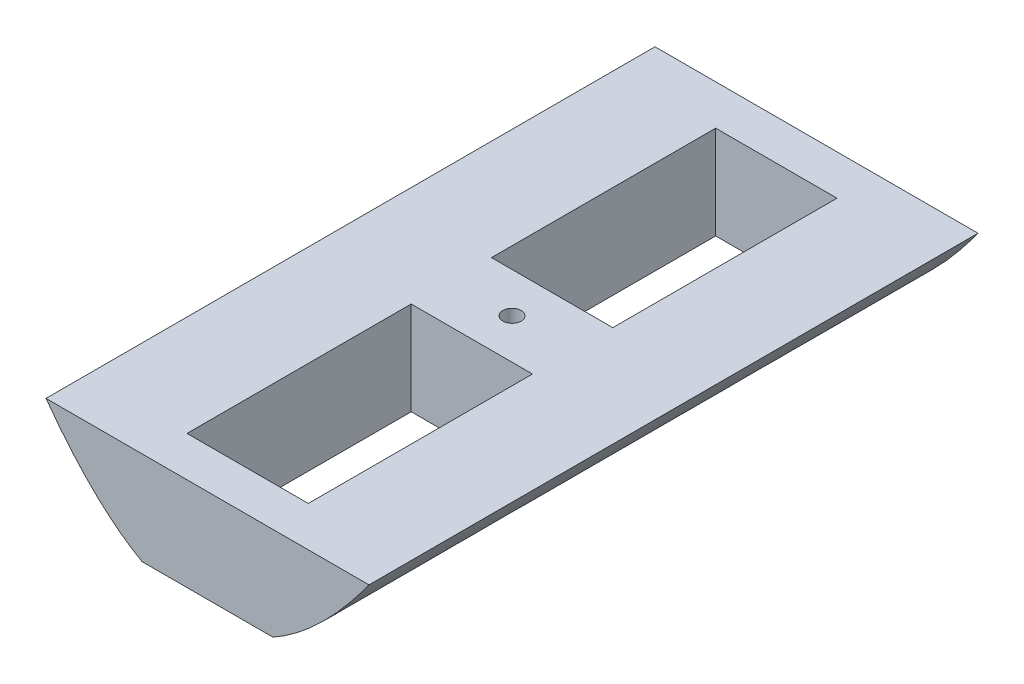
ISO-10303-21;
HEADER;
FILE_DESCRIPTION(('STEP AP214'),'2;1');
FILE_NAME('part.step','',(''),(''),'','','');
FILE_SCHEMA(('AUTOMOTIVE_DESIGN { 1 0 10303 214 1 1 1 1 }'));
ENDSEC;
DATA;
#1=APPLICATION_CONTEXT('core data for automotive mechanical design processes');
#2=APPLICATION_PROTOCOL_DEFINITION('international standard','automotive_design',2000,#1);
#3=PRODUCT_CONTEXT('',#1,'mechanical');
#4=PRODUCT('Part','Part','',(#3));
#5=PRODUCT_RELATED_PRODUCT_CATEGORY('part','',(#4));
#6=PRODUCT_DEFINITION_FORMATION('','',#4);
#7=PRODUCT_DEFINITION_CONTEXT('part definition',#1,'design');
#8=PRODUCT_DEFINITION('design','',#6,#7);
#9=PRODUCT_DEFINITION_SHAPE('','',#8);
#10=(LENGTH_UNIT() NAMED_UNIT(*) SI_UNIT(.MILLI.,.METRE.));
#11=(NAMED_UNIT(*) PLANE_ANGLE_UNIT() SI_UNIT($,.RADIAN.));
#12=(NAMED_UNIT(*) SI_UNIT($,.STERADIAN.) SOLID_ANGLE_UNIT());
#13=UNCERTAINTY_MEASURE_WITH_UNIT(LENGTH_MEASURE(1.E-05),#10,'distance_accuracy_value','');
#14=(GEOMETRIC_REPRESENTATION_CONTEXT(3) GLOBAL_UNCERTAINTY_ASSIGNED_CONTEXT((#13)) GLOBAL_UNIT_ASSIGNED_CONTEXT((#10,
#11,#12)) REPRESENTATION_CONTEXT('',''));
#15=CARTESIAN_POINT('',(0.,0.,0.));
#16=DIRECTION('',(0.,0.,1.));
#17=DIRECTION('',(1.,0.,0.));
#18=AXIS2_PLACEMENT_3D('',#15,#16,#17);
#19=CARTESIAN_POINT('',(-127.000000000214,127.000000000428,331.382));
#20=CARTESIAN_POINT('',(-3.79340656109228E-11,-127.000000000353,331.382));
#21=CARTESIAN_POINT('',(127.000000000138,127.000000000277,331.382));
#22=B_SPLINE_CURVE_WITH_KNOTS('',2,(#19,#20,#21),.UNSPECIFIED.,.F.,.F.,(3,3),
(0.0560283962320779,0.943971603767657),.UNSPECIFIED.);
#23=DIRECTION('',(0.,0.,-1.));
#24=VECTOR('',#23,1.);
#25=SURFACE_OF_LINEAR_EXTRUSION('',#22,#24);
#26=CARTESIAN_POINT('',(-87.8726351031225,60.8,331.382));
#27=VERTEX_POINT('',#26);
#28=CARTESIAN_POINT('',(-35.6370593624671,10.,331.382));
#29=VERTEX_POINT('',#28);
#30=EDGE_CURVE('E11',#27,#29,#22,.T.);
#31=ORIENTED_EDGE('',*,*,#30,.F.);
#32=DIRECTION('',(0.,0.,-1.));
#33=VECTOR('',#32,1.);
#34=CARTESIAN_POINT('',(-87.872635103313,60.8,331.382));
#35=LINE('',#34,#33);
#36=CARTESIAN_POINT('',(-87.8726351031226,60.8,0.));
#37=VERTEX_POINT('',#36);
#38=EDGE_CURVE('E121',#27,#37,#35,.T.);
#39=ORIENTED_EDGE('',*,*,#38,.T.);
#40=CARTESIAN_POINT('',(-127.000000000214,127.000000000428,0.));
#41=CARTESIAN_POINT('',(-3.79340656109228E-11,-127.000000000353,0.));
#42=CARTESIAN_POINT('',(127.000000000138,127.000000000277,0.));
#43=B_SPLINE_CURVE_WITH_KNOTS('',2,(#40,#41,#42),.UNSPECIFIED.,.F.,.F.,(3,3),
(0.0560283962320779,0.943971603767657),.UNSPECIFIED.);
#44=CARTESIAN_POINT('',(-35.6370593624671,10.0000000000315,0.));
#45=VERTEX_POINT('',#44);
#46=EDGE_CURVE('E141',#37,#45,#43,.T.);
#47=ORIENTED_EDGE('',*,*,#46,.T.);
#48=DIRECTION('',(0.,0.,-1.));
#49=VECTOR('',#48,1.);
#50=CARTESIAN_POINT('',(-35.6370593624108,9.99999999999995,331.382));
#51=LINE('',#50,#49);
#52=EDGE_CURVE('E140',#45,#29,#51,.F.);
#53=ORIENTED_EDGE('',*,*,#52,.T.);
#54=EDGE_LOOP('',(#31,#39,#47,#53));
#55=FACE_BOUND('',#54,.T.);
#56=ADVANCED_FACE('F33',(#55),#25,.F.);
#57=CARTESIAN_POINT('',(35.637059362467,10.,0.));
#58=VERTEX_POINT('',#57);
#59=CARTESIAN_POINT('',(87.8726351031226,60.7999999997364,0.));
#60=VERTEX_POINT('',#59);
#61=EDGE_CURVE('E167',#58,#60,#43,.T.);
#62=ORIENTED_EDGE('',*,*,#61,.T.);
#63=DIRECTION('',(0.,0.,-1.));
#64=VECTOR('',#63,1.);
#65=CARTESIAN_POINT('',(87.872635103313,60.8,331.382));
#66=LINE('',#65,#64);
#67=CARTESIAN_POINT('',(87.8726351031225,60.8,331.382));
#68=VERTEX_POINT('',#67);
#69=EDGE_CURVE('E50',#60,#68,#66,.F.);
#70=ORIENTED_EDGE('',*,*,#69,.T.);
#71=CARTESIAN_POINT('',(35.637059362467,10.,331.382));
#72=VERTEX_POINT('',#71);
#73=EDGE_CURVE('E43',#72,#68,#22,.T.);
#74=ORIENTED_EDGE('',*,*,#73,.F.);
#75=DIRECTION('',(0.,0.,-1.));
#76=VECTOR('',#75,1.);
#77=CARTESIAN_POINT('',(35.6370593624109,10.,331.382));
#78=LINE('',#77,#76);
#79=EDGE_CURVE('E145',#72,#58,#78,.T.);
#80=ORIENTED_EDGE('',*,*,#79,.T.);
#81=EDGE_LOOP('',(#62,#70,#74,#80));
#82=FACE_BOUND('',#81,.T.);
#83=ADVANCED_FACE('F35',(#82),#25,.F.);
#84=CARTESIAN_POINT('',(-3.79349329726608E-11,0.,331.382));
#85=DIRECTION('',(0.,0.,-1.));
#86=DIRECTION('',(-1.,0.,0.));
#87=AXIS2_PLACEMENT_3D('',#84,#85,#86);
#88=PLANE('',#87);
#89=ORIENTED_EDGE('',*,*,#73,.T.);
#90=DIRECTION('',(1.,0.,0.));
#91=VECTOR('',#90,1.);
#92=CARTESIAN_POINT('',(-130.,60.8,331.382));
#93=LINE('',#92,#91);
#94=EDGE_CURVE('E124',#27,#68,#93,.T.);
#95=ORIENTED_EDGE('',*,*,#94,.F.);
#96=ORIENTED_EDGE('',*,*,#30,.T.);
#97=DIRECTION('',(1.,0.,0.));
#98=VECTOR('',#97,1.);
#99=CARTESIAN_POINT('',(40.,10.,331.382));
#100=LINE('',#99,#98);
#101=EDGE_CURVE('E190',#29,#72,#100,.T.);
#102=ORIENTED_EDGE('',*,*,#101,.T.);
#103=EDGE_LOOP('',(#89,#95,#96,#102));
#104=FACE_BOUND('',#103,.T.);
#105=ADVANCED_FACE('F133',(#104),#88,.F.);
#106=CARTESIAN_POINT('',(-3.79349329726608E-11,0.,0.));
#107=DIRECTION('',(0.,0.,-1.));
#108=DIRECTION('',(-1.,0.,0.));
#109=AXIS2_PLACEMENT_3D('',#106,#107,#108);
#110=PLANE('',#109);
#111=DIRECTION('',(1.,0.,0.));
#112=VECTOR('',#111,1.);
#113=CARTESIAN_POINT('',(-130.,60.8,0.));
#114=LINE('',#113,#112);
#115=EDGE_CURVE('E125',#37,#60,#114,.T.);
#116=ORIENTED_EDGE('',*,*,#115,.T.);
#117=ORIENTED_EDGE('',*,*,#61,.F.);
#118=DIRECTION('',(1.,0.,0.));
#119=VECTOR('',#118,1.);
#120=CARTESIAN_POINT('',(40.,10.,0.));
#121=LINE('',#120,#119);
#122=EDGE_CURVE('E129',#45,#58,#121,.T.);
#123=ORIENTED_EDGE('',*,*,#122,.F.);
#124=ORIENTED_EDGE('',*,*,#46,.F.);
#125=EDGE_LOOP('',(#116,#117,#123,#124));
#126=FACE_BOUND('',#125,.T.);
#127=ADVANCED_FACE('F238',(#126),#110,.T.);
#128=CARTESIAN_POINT('',(-33.,-3.79141162909491E-11,21.8455));
#129=DIRECTION('',(-1.,0.,0.));
#130=DIRECTION('',(0.,0.,1.));
#131=AXIS2_PLACEMENT_3D('',#128,#129,#130);
#132=PLANE('',#131);
#133=DIRECTION('',(0.,1.,0.));
#134=VECTOR('',#133,1.);
#135=CARTESIAN_POINT('',(-33.,-3.79141162909491E-11,21.8455));
#136=LINE('',#135,#134);
#137=CARTESIAN_POINT('',(-33.,10.,21.8455));
#138=VERTEX_POINT('',#137);
#139=CARTESIAN_POINT('',(-33.,60.8,21.8455));
#140=VERTEX_POINT('',#139);
#141=EDGE_CURVE('E164',#138,#140,#136,.T.);
#142=ORIENTED_EDGE('',*,*,#141,.T.);
#143=DIRECTION('',(0.,0.,1.));
#144=VECTOR('',#143,1.);
#145=CARTESIAN_POINT('',(-33.,60.8,21.8455));
#146=LINE('',#145,#144);
#147=CARTESIAN_POINT('',(-33.,60.8,143.8455));
#148=VERTEX_POINT('',#147);
#149=EDGE_CURVE('E228',#140,#148,#146,.T.);
#150=ORIENTED_EDGE('',*,*,#149,.T.);
#151=DIRECTION('',(0.,1.,0.));
#152=VECTOR('',#151,1.);
#153=CARTESIAN_POINT('',(-33.,-3.79141162909491E-11,143.8455));
#154=LINE('',#153,#152);
#155=CARTESIAN_POINT('',(-33.,10.,143.8455));
#156=VERTEX_POINT('',#155);
#157=EDGE_CURVE('E158',#156,#148,#154,.T.);
#158=ORIENTED_EDGE('',*,*,#157,.F.);
#159=DIRECTION('',(0.,0.,-1.));
#160=VECTOR('',#159,1.);
#161=CARTESIAN_POINT('',(-33.,10.,21.8455));
#162=LINE('',#161,#160);
#163=EDGE_CURVE('E151',#156,#138,#162,.T.);
#164=ORIENTED_EDGE('',*,*,#163,.T.);
#165=EDGE_LOOP('',(#142,#150,#158,#164));
#166=FACE_BOUND('',#165,.T.);
#167=ADVANCED_FACE('F220',(#166),#132,.F.);
#168=CARTESIAN_POINT('',(-33.,-3.79141162909491E-11,21.8455));
#169=DIRECTION('',(0.,0.,-1.));
#170=DIRECTION('',(-1.,0.,0.));
#171=AXIS2_PLACEMENT_3D('',#168,#169,#170);
#172=PLANE('',#171);
#173=DIRECTION('',(0.,1.,0.));
#174=VECTOR('',#173,1.);
#175=CARTESIAN_POINT('',(33.,-3.79141162909491E-11,21.8455));
#176=LINE('',#175,#174);
#177=CARTESIAN_POINT('',(33.,10.,21.8455));
#178=VERTEX_POINT('',#177);
#179=CARTESIAN_POINT('',(33.,60.8,21.8455));
#180=VERTEX_POINT('',#179);
#181=EDGE_CURVE('E168',#178,#180,#176,.T.);
#182=ORIENTED_EDGE('',*,*,#181,.T.);
#183=DIRECTION('',(-1.,0.,0.));
#184=VECTOR('',#183,1.);
#185=CARTESIAN_POINT('',(-33.,60.8,21.8455));
#186=LINE('',#185,#184);
#187=EDGE_CURVE('E227',#180,#140,#186,.T.);
#188=ORIENTED_EDGE('',*,*,#187,.T.);
#189=ORIENTED_EDGE('',*,*,#141,.F.);
#190=DIRECTION('',(1.,0.,0.));
#191=VECTOR('',#190,1.);
#192=CARTESIAN_POINT('',(-33.,10.,21.8455));
#193=LINE('',#192,#191);
#194=EDGE_CURVE('E214',#138,#178,#193,.T.);
#195=ORIENTED_EDGE('',*,*,#194,.T.);
#196=EDGE_LOOP('',(#182,#188,#189,#195));
#197=FACE_BOUND('',#196,.T.);
#198=ADVANCED_FACE('F225',(#197),#172,.F.);
#199=CARTESIAN_POINT('',(33.,-3.79141162909491E-11,21.8455));
#200=DIRECTION('',(1.,0.,0.));
#201=DIRECTION('',(0.,0.,-1.));
#202=AXIS2_PLACEMENT_3D('',#199,#200,#201);
#203=PLANE('',#202);
#204=DIRECTION('',(0.,1.,0.));
#205=VECTOR('',#204,1.);
#206=CARTESIAN_POINT('',(33.,-3.79141162909491E-11,143.8455));
#207=LINE('',#206,#205);
#208=CARTESIAN_POINT('',(33.,10.,143.8455));
#209=VERTEX_POINT('',#208);
#210=CARTESIAN_POINT('',(33.,60.8,143.8455));
#211=VERTEX_POINT('',#210);
#212=EDGE_CURVE('E171',#209,#211,#207,.T.);
#213=ORIENTED_EDGE('',*,*,#212,.T.);
#214=DIRECTION('',(0.,0.,-1.));
#215=VECTOR('',#214,1.);
#216=CARTESIAN_POINT('',(33.,60.8,21.8455));
#217=LINE('',#216,#215);
#218=EDGE_CURVE('E58',#211,#180,#217,.T.);
#219=ORIENTED_EDGE('',*,*,#218,.T.);
#220=ORIENTED_EDGE('',*,*,#181,.F.);
#221=DIRECTION('',(0.,0.,1.));
#222=VECTOR('',#221,1.);
#223=CARTESIAN_POINT('',(33.,10.,21.8455));
#224=LINE('',#223,#222);
#225=EDGE_CURVE('E211',#178,#209,#224,.T.);
#226=ORIENTED_EDGE('',*,*,#225,.T.);
#227=EDGE_LOOP('',(#213,#219,#220,#226));
#228=FACE_BOUND('',#227,.T.);
#229=ADVANCED_FACE('F257',(#228),#203,.F.);
#230=CARTESIAN_POINT('',(-33.,-3.79141162909491E-11,143.8455));
#231=DIRECTION('',(0.,0.,1.));
#232=DIRECTION('',(1.,0.,0.));
#233=AXIS2_PLACEMENT_3D('',#230,#231,#232);
#234=PLANE('',#233);
#235=ORIENTED_EDGE('',*,*,#157,.T.);
#236=DIRECTION('',(1.,0.,0.));
#237=VECTOR('',#236,1.);
#238=CARTESIAN_POINT('',(-33.,60.8,143.8455));
#239=LINE('',#238,#237);
#240=EDGE_CURVE('E231',#148,#211,#239,.T.);
#241=ORIENTED_EDGE('',*,*,#240,.T.);
#242=ORIENTED_EDGE('',*,*,#212,.F.);
#243=DIRECTION('',(-1.,0.,0.));
#244=VECTOR('',#243,1.);
#245=CARTESIAN_POINT('',(-33.,10.,143.8455));
#246=LINE('',#245,#244);
#247=EDGE_CURVE('E208',#209,#156,#246,.T.);
#248=ORIENTED_EDGE('',*,*,#247,.T.);
#249=EDGE_LOOP('',(#235,#241,#242,#248));
#250=FACE_BOUND('',#249,.T.);
#251=ADVANCED_FACE('F255',(#250),#234,.F.);
#252=CARTESIAN_POINT('',(-33.,-3.79141162909491E-11,187.5365));
#253=DIRECTION('',(-1.,0.,0.));
#254=DIRECTION('',(0.,0.,1.));
#255=AXIS2_PLACEMENT_3D('',#252,#253,#254);
#256=PLANE('',#255);
#257=DIRECTION('',(0.,1.,0.));
#258=VECTOR('',#257,1.);
#259=CARTESIAN_POINT('',(-33.,-3.79141162909491E-11,187.5365));
#260=LINE('',#259,#258);
#261=CARTESIAN_POINT('',(-33.,10.,187.5365));
#262=VERTEX_POINT('',#261);
#263=CARTESIAN_POINT('',(-33.,60.8,187.5365));
#264=VERTEX_POINT('',#263);
#265=EDGE_CURVE('E155',#262,#264,#260,.T.);
#266=ORIENTED_EDGE('',*,*,#265,.T.);
#267=DIRECTION('',(0.,0.,1.));
#268=VECTOR('',#267,1.);
#269=CARTESIAN_POINT('',(-33.,60.8,187.5365));
#270=LINE('',#269,#268);
#271=CARTESIAN_POINT('',(-33.,60.8,309.5365));
#272=VERTEX_POINT('',#271);
#273=EDGE_CURVE('E251',#264,#272,#270,.T.);
#274=ORIENTED_EDGE('',*,*,#273,.T.);
#275=DIRECTION('',(0.,1.,0.));
#276=VECTOR('',#275,1.);
#277=CARTESIAN_POINT('',(-33.,-3.79141162909491E-11,309.5365));
#278=LINE('',#277,#276);
#279=CARTESIAN_POINT('',(-33.,10.,309.5365));
#280=VERTEX_POINT('',#279);
#281=EDGE_CURVE('E144',#280,#272,#278,.T.);
#282=ORIENTED_EDGE('',*,*,#281,.F.);
#283=DIRECTION('',(0.,0.,-1.));
#284=VECTOR('',#283,1.);
#285=CARTESIAN_POINT('',(-33.,10.,187.5365));
#286=LINE('',#285,#284);
#287=EDGE_CURVE('E205',#280,#262,#286,.T.);
#288=ORIENTED_EDGE('',*,*,#287,.T.);
#289=EDGE_LOOP('',(#266,#274,#282,#288));
#290=FACE_BOUND('',#289,.T.);
#291=ADVANCED_FACE('F289',(#290),#256,.F.);
#292=CARTESIAN_POINT('',(-33.,-3.79141162909491E-11,187.5365));
#293=DIRECTION('',(0.,0.,-1.));
#294=DIRECTION('',(-1.,0.,0.));
#295=AXIS2_PLACEMENT_3D('',#292,#293,#294);
#296=PLANE('',#295);
#297=DIRECTION('',(0.,1.,0.));
#298=VECTOR('',#297,1.);
#299=CARTESIAN_POINT('',(33.,-3.79141162909491E-11,187.5365));
#300=LINE('',#299,#298);
#301=CARTESIAN_POINT('',(33.,10.,187.5365));
#302=VERTEX_POINT('',#301);
#303=CARTESIAN_POINT('',(33.,60.8,187.5365));
#304=VERTEX_POINT('',#303);
#305=EDGE_CURVE('E159',#302,#304,#300,.T.);
#306=ORIENTED_EDGE('',*,*,#305,.T.);
#307=DIRECTION('',(-1.,0.,0.));
#308=VECTOR('',#307,1.);
#309=CARTESIAN_POINT('',(-33.,60.8,187.5365));
#310=LINE('',#309,#308);
#311=EDGE_CURVE('E248',#304,#264,#310,.T.);
#312=ORIENTED_EDGE('',*,*,#311,.T.);
#313=ORIENTED_EDGE('',*,*,#265,.F.);
#314=DIRECTION('',(1.,0.,0.));
#315=VECTOR('',#314,1.);
#316=CARTESIAN_POINT('',(-33.,10.,187.5365));
#317=LINE('',#316,#315);
#318=EDGE_CURVE('E202',#262,#302,#317,.T.);
#319=ORIENTED_EDGE('',*,*,#318,.T.);
#320=EDGE_LOOP('',(#306,#312,#313,#319));
#321=FACE_BOUND('',#320,.T.);
#322=ADVANCED_FACE('F296',(#321),#296,.F.);
#323=CARTESIAN_POINT('',(33.,-3.79141162909491E-11,187.5365));
#324=DIRECTION('',(1.,0.,0.));
#325=DIRECTION('',(0.,0.,-1.));
#326=AXIS2_PLACEMENT_3D('',#323,#324,#325);
#327=PLANE('',#326);
#328=DIRECTION('',(0.,1.,0.));
#329=VECTOR('',#328,1.);
#330=CARTESIAN_POINT('',(33.,-3.79141162909491E-11,309.5365));
#331=LINE('',#330,#329);
#332=CARTESIAN_POINT('',(33.,10.,309.5365));
#333=VERTEX_POINT('',#332);
#334=CARTESIAN_POINT('',(33.,60.8,309.5365));
#335=VERTEX_POINT('',#334);
#336=EDGE_CURVE('E148',#333,#335,#331,.T.);
#337=ORIENTED_EDGE('',*,*,#336,.T.);
#338=DIRECTION('',(0.,0.,-1.));
#339=VECTOR('',#338,1.);
#340=CARTESIAN_POINT('',(33.,60.8,187.5365));
#341=LINE('',#340,#339);
#342=EDGE_CURVE('E245',#335,#304,#341,.T.);
#343=ORIENTED_EDGE('',*,*,#342,.T.);
#344=ORIENTED_EDGE('',*,*,#305,.F.);
#345=DIRECTION('',(0.,0.,1.));
#346=VECTOR('',#345,1.);
#347=CARTESIAN_POINT('',(33.,10.,187.5365));
#348=LINE('',#347,#346);
#349=EDGE_CURVE('E194',#302,#333,#348,.T.);
#350=ORIENTED_EDGE('',*,*,#349,.T.);
#351=EDGE_LOOP('',(#337,#343,#344,#350));
#352=FACE_BOUND('',#351,.T.);
#353=ADVANCED_FACE('F300',(#352),#327,.F.);
#354=CARTESIAN_POINT('',(-33.,-3.79141162909491E-11,309.5365));
#355=DIRECTION('',(0.,0.,1.));
#356=DIRECTION('',(1.,0.,0.));
#357=AXIS2_PLACEMENT_3D('',#354,#355,#356);
#358=PLANE('',#357);
#359=ORIENTED_EDGE('',*,*,#281,.T.);
#360=DIRECTION('',(1.,0.,0.));
#361=VECTOR('',#360,1.);
#362=CARTESIAN_POINT('',(-33.,60.8,309.5365));
#363=LINE('',#362,#361);
#364=EDGE_CURVE('E241',#272,#335,#363,.T.);
#365=ORIENTED_EDGE('',*,*,#364,.T.);
#366=ORIENTED_EDGE('',*,*,#336,.F.);
#367=DIRECTION('',(-1.,0.,0.));
#368=VECTOR('',#367,1.);
#369=CARTESIAN_POINT('',(-33.,10.,309.5365));
#370=LINE('',#369,#368);
#371=EDGE_CURVE('E189',#333,#280,#370,.T.);
#372=ORIENTED_EDGE('',*,*,#371,.T.);
#373=EDGE_LOOP('',(#359,#365,#366,#372));
#374=FACE_BOUND('',#373,.T.);
#375=ADVANCED_FACE('F269',(#374),#358,.F.);
#376=CARTESIAN_POINT('',(-3.86635168325711E-11,-3.79141162909491E-11,165.691));
#377=DIRECTION('',(0.,1.,0.));
#378=DIRECTION('',(0.,0.,1.));
#379=AXIS2_PLACEMENT_3D('',#376,#377,#378);
#380=CYLINDRICAL_SURFACE('',#379,5.);
#381=CARTESIAN_POINT('',(-3.86635168325711E-11,60.8,165.691));
#382=DIRECTION('',(0.,-1.,0.));
#383=DIRECTION('',(0.,0.,-1.));
#384=AXIS2_PLACEMENT_3D('',#381,#382,#383);
#385=CIRCLE('',#384,5.);
#386=CARTESIAN_POINT('',(-3.86635168325711E-11,60.8,170.691));
#387=VERTEX_POINT('',#386);
#388=EDGE_CURVE('E38',#387,#387,#385,.F.);
#389=CARTESIAN_POINT('',(-3.86635168325711E-11,10.,165.691));
#390=DIRECTION('',(0.,1.,0.));
#391=DIRECTION('',(0.,0.,1.));
#392=AXIS2_PLACEMENT_3D('',#389,#390,#391);
#393=CIRCLE('',#392,5.);
#394=CARTESIAN_POINT('',(-3.86635168325711E-11,10.,170.691));
#395=VERTEX_POINT('',#394);
#396=EDGE_CURVE('E184',#395,#395,#393,.F.);
#397=CARTESIAN_POINT('',(-3.86635168325711E-11,60.8,170.691));
#398=CARTESIAN_POINT('',(-3.86635168325711E-11,60.2708333333333,170.691));
#399=CARTESIAN_POINT('',(-3.86635168325711E-11,59.7416666666667,170.691));
#400=CARTESIAN_POINT('',(-3.86635168325711E-11,58.6833333333333,170.691));
#401=CARTESIAN_POINT('',(-3.86635168325711E-11,58.1541666666667,170.691));
#402=CARTESIAN_POINT('',(-3.86635168325711E-11,57.0958333333333,170.691));
#403=CARTESIAN_POINT('',(-3.86635168325711E-11,56.5666666666667,170.691));
#404=CARTESIAN_POINT('',(-3.86635168325711E-11,55.5083333333333,170.691));
#405=CARTESIAN_POINT('',(-3.86635168325711E-11,54.9791666666667,170.691));
#406=CARTESIAN_POINT('',(-3.86635168325711E-11,53.9208333333333,170.691));
#407=CARTESIAN_POINT('',(-3.86635168325711E-11,53.3916666666667,170.691));
#408=CARTESIAN_POINT('',(-3.86635168325711E-11,52.3333333333333,170.691));
#409=CARTESIAN_POINT('',(-3.86635168325711E-11,51.8041666666667,170.691));
#410=CARTESIAN_POINT('',(-3.86635168325711E-11,50.7458333333333,170.691));
#411=CARTESIAN_POINT('',(-3.86635168325711E-11,50.2166666666667,170.691));
#412=CARTESIAN_POINT('',(-3.86635168325711E-11,49.1583333333333,170.691));
#413=CARTESIAN_POINT('',(-3.86635168325711E-11,48.6291666666667,170.691));
#414=CARTESIAN_POINT('',(-3.86635168325711E-11,47.5708333333333,170.691));
#415=CARTESIAN_POINT('',(-3.86635168325711E-11,47.0416666666667,170.691));
#416=CARTESIAN_POINT('',(-3.86635168325711E-11,45.9833333333333,170.691));
#417=CARTESIAN_POINT('',(-3.86635168325711E-11,45.4541666666667,170.691));
#418=CARTESIAN_POINT('',(-3.86635168325711E-11,44.3958333333333,170.691));
#419=CARTESIAN_POINT('',(-3.86635168325711E-11,43.8666666666667,170.691));
#420=CARTESIAN_POINT('',(-3.86635168325711E-11,42.8083333333333,170.691));
#421=CARTESIAN_POINT('',(-3.86635168325711E-11,42.2791666666667,170.691));
#422=CARTESIAN_POINT('',(-3.86635168325711E-11,41.2208333333333,170.691));
#423=CARTESIAN_POINT('',(-3.86635168325711E-11,40.6916666666667,170.691));
#424=CARTESIAN_POINT('',(-3.86635168325711E-11,39.6333333333333,170.691));
#425=CARTESIAN_POINT('',(-3.86635168325711E-11,39.1041666666667,170.691));
#426=CARTESIAN_POINT('',(-3.86635168325711E-11,38.0458333333333,170.691));
#427=CARTESIAN_POINT('',(-3.86635168325711E-11,37.5166666666667,170.691));
#428=CARTESIAN_POINT('',(-3.86635168325711E-11,36.4583333333333,170.691));
#429=CARTESIAN_POINT('',(-3.86635168325711E-11,35.9291666666667,170.691));
#430=CARTESIAN_POINT('',(-3.86635168325711E-11,34.8708333333333,170.691));
#431=CARTESIAN_POINT('',(-3.86635168325711E-11,34.3416666666667,170.691));
#432=CARTESIAN_POINT('',(-3.86635168325711E-11,33.2833333333333,170.691));
#433=CARTESIAN_POINT('',(-3.86635168325711E-11,32.7541666666667,170.691));
#434=CARTESIAN_POINT('',(-3.86635168325711E-11,31.6958333333333,170.691));
#435=CARTESIAN_POINT('',(-3.86635168325711E-11,31.1666666666667,170.691));
#436=CARTESIAN_POINT('',(-3.86635168325711E-11,30.1083333333333,170.691));
#437=CARTESIAN_POINT('',(-3.86635168325711E-11,29.5791666666667,170.691));
#438=CARTESIAN_POINT('',(-3.86635168325711E-11,28.5208333333333,170.691));
#439=CARTESIAN_POINT('',(-3.86635168325711E-11,27.9916666666667,170.691));
#440=CARTESIAN_POINT('',(-3.86635168325711E-11,26.9333333333333,170.691));
#441=CARTESIAN_POINT('',(-3.86635168325711E-11,26.4041666666667,170.691));
#442=CARTESIAN_POINT('',(-3.86635168325711E-11,25.3458333333333,170.691));
#443=CARTESIAN_POINT('',(-3.86635168325711E-11,24.8166666666667,170.691));
#444=CARTESIAN_POINT('',(-3.86635168325711E-11,23.7583333333333,170.691));
#445=CARTESIAN_POINT('',(-3.86635168325711E-11,23.2291666666667,170.691));
#446=CARTESIAN_POINT('',(-3.86635168325711E-11,22.1708333333333,170.691));
#447=CARTESIAN_POINT('',(-3.86635168325711E-11,21.6416666666667,170.691));
#448=CARTESIAN_POINT('',(-3.86635168325711E-11,20.5833333333333,170.691));
#449=CARTESIAN_POINT('',(-3.86635168325711E-11,20.0541666666667,170.691));
#450=CARTESIAN_POINT('',(-3.86635168325711E-11,18.9958333333333,170.691));
#451=CARTESIAN_POINT('',(-3.86635168325711E-11,18.4666666666667,170.691));
#452=CARTESIAN_POINT('',(-3.86635168325711E-11,17.4083333333333,170.691));
#453=CARTESIAN_POINT('',(-3.86635168325711E-11,16.8791666666667,170.691));
#454=CARTESIAN_POINT('',(-3.86635168325711E-11,15.8208333333333,170.691));
#455=CARTESIAN_POINT('',(-3.86635168325711E-11,15.2916666666667,170.691));
#456=CARTESIAN_POINT('',(-3.86635168325711E-11,14.2333333333333,170.691));
#457=CARTESIAN_POINT('',(-3.86635168325711E-11,13.7041666666667,170.691));
#458=CARTESIAN_POINT('',(-3.86635168325711E-11,12.6458333333333,170.691));
#459=CARTESIAN_POINT('',(-3.86635168325711E-11,12.1166666666667,170.691));
#460=CARTESIAN_POINT('',(-3.86635168325711E-11,11.0583333333333,170.691));
#461=CARTESIAN_POINT('',(-3.86635168325711E-11,10.5291666666667,170.691));
#462=CARTESIAN_POINT('',(-3.86635168325711E-11,9.99999999999999,170.691));
#463=B_SPLINE_CURVE_WITH_KNOTS('',3,(#397,#398,#399,#400,#401,#402,#403,#404,#405,#406,#407,
#408,#409,#410,#411,#412,#413,#414,#415,#416,#417,#418,#419,#420,#421,#422,#423,#424,#425,#426,
#427,#428,#429,#430,#431,#432,#433,#434,#435,#436,#437,#438,#439,#440,#441,#442,#443,#444,#445,
#446,#447,#448,#449,#450,#451,#452,#453,#454,#455,#456,#457,#458,#459,#460,#461,#462),
.UNSPECIFIED.,.F.,.F.,(4,2,2,2,2,2,2,2,2,2,2,2,2,2,2,2,2,2,2,2,2,2,2,2,2,2,2,2,2,2,2,2,4),(0.,
1.5875,3.175,4.7625,6.35,7.9375,9.525,11.1125,12.7,14.2875,15.875,17.4625,19.05,20.6375,22.225,
23.8125,25.4,26.9875,28.575,30.1625,31.75,33.3375,34.925,36.5125,38.1,39.6875,41.275,42.8625,
44.45,46.0375,47.625,49.2125,50.8),.UNSPECIFIED.);
#464=EDGE_CURVE('BSEAM260',#387,#395,#463,.T.);
#465=ORIENTED_EDGE('',*,*,#388,.T.);
#466=ORIENTED_EDGE('',*,*,#396,.T.);
#467=ORIENTED_EDGE('',*,*,#464,.T.);
#468=ORIENTED_EDGE('',*,*,#464,.F.);
#469=EDGE_LOOP('',(#465,#467,#466,#468));
#470=FACE_BOUND('',#469,.T.);
#471=ADVANCED_FACE('F260',(#470),#380,.F.);
#472=CARTESIAN_POINT('',(40.,10.,331.382));
#473=DIRECTION('',(0.,1.,0.));
#474=DIRECTION('',(0.,0.,1.));
#475=AXIS2_PLACEMENT_3D('',#472,#473,#474);
#476=PLANE('',#475);
#477=ORIENTED_EDGE('',*,*,#396,.F.);
#478=EDGE_LOOP('',(#477));
#479=FACE_BOUND('',#478,.T.);
#480=ORIENTED_EDGE('',*,*,#371,.F.);
#481=ORIENTED_EDGE('',*,*,#349,.F.);
#482=ORIENTED_EDGE('',*,*,#318,.F.);
#483=ORIENTED_EDGE('',*,*,#287,.F.);
#484=EDGE_LOOP('',(#480,#481,#482,#483));
#485=FACE_BOUND('',#484,.T.);
#486=ORIENTED_EDGE('',*,*,#247,.F.);
#487=ORIENTED_EDGE('',*,*,#225,.F.);
#488=ORIENTED_EDGE('',*,*,#194,.F.);
#489=ORIENTED_EDGE('',*,*,#163,.F.);
#490=EDGE_LOOP('',(#486,#487,#488,#489));
#491=FACE_BOUND('',#490,.T.);
#492=ORIENTED_EDGE('',*,*,#122,.T.);
#493=ORIENTED_EDGE('',*,*,#79,.F.);
#494=ORIENTED_EDGE('',*,*,#101,.F.);
#495=ORIENTED_EDGE('',*,*,#52,.F.);
#496=EDGE_LOOP('',(#492,#493,#494,#495));
#497=FACE_BOUND('',#496,.T.);
#498=ADVANCED_FACE('F258',(#479,#485,#491,#497),#476,.F.);
#499=CARTESIAN_POINT('',(-130.,60.8,0.));
#500=DIRECTION('',(0.,-1.,0.));
#501=DIRECTION('',(0.,0.,-1.));
#502=AXIS2_PLACEMENT_3D('',#499,#500,#501);
#503=PLANE('',#502);
#504=ORIENTED_EDGE('',*,*,#388,.F.);
#505=EDGE_LOOP('',(#504));
#506=FACE_BOUND('',#505,.T.);
#507=ORIENTED_EDGE('',*,*,#311,.F.);
#508=ORIENTED_EDGE('',*,*,#342,.F.);
#509=ORIENTED_EDGE('',*,*,#364,.F.);
#510=ORIENTED_EDGE('',*,*,#273,.F.);
#511=EDGE_LOOP('',(#507,#508,#509,#510));
#512=FACE_BOUND('',#511,.T.);
#513=ORIENTED_EDGE('',*,*,#187,.F.);
#514=ORIENTED_EDGE('',*,*,#218,.F.);
#515=ORIENTED_EDGE('',*,*,#240,.F.);
#516=ORIENTED_EDGE('',*,*,#149,.F.);
#517=EDGE_LOOP('',(#513,#514,#515,#516));
#518=FACE_BOUND('',#517,.T.);
#519=ORIENTED_EDGE('',*,*,#94,.T.);
#520=ORIENTED_EDGE('',*,*,#69,.F.);
#521=ORIENTED_EDGE('',*,*,#115,.F.);
#522=ORIENTED_EDGE('',*,*,#38,.F.);
#523=EDGE_LOOP('',(#519,#520,#521,#522));
#524=FACE_BOUND('',#523,.T.);
#525=ADVANCED_FACE('F123',(#506,#512,#518,#524),#503,.F.);
#526=CLOSED_SHELL('',(#56,#83,#105,#127,#167,#198,#229,#251,#291,#322,#353,#375,#471,#498,#525));
#527=MANIFOLD_SOLID_BREP('B2',#526);
#528=ADVANCED_BREP_SHAPE_REPRESENTATION('',(#18,#527),#14);
#529=SHAPE_DEFINITION_REPRESENTATION(#9,#528);
ENDSEC;
END-ISO-10303-21;
